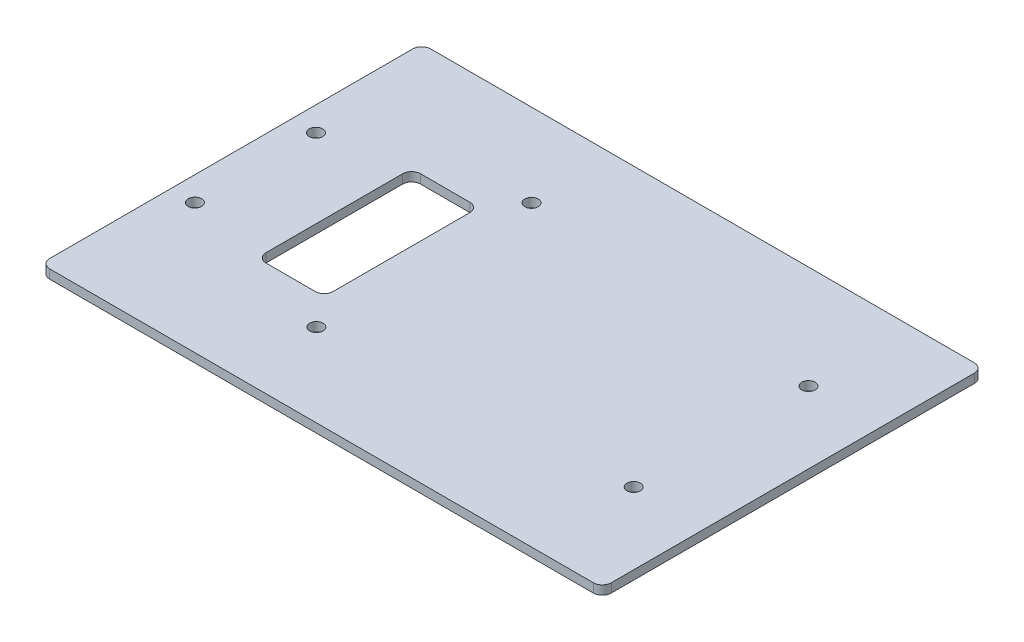
ISO-10303-21;
HEADER;
FILE_DESCRIPTION(('STEP AP214'),'2;1');
FILE_NAME('part.step','',(''),(''),'','','');
FILE_SCHEMA(('AUTOMOTIVE_DESIGN { 1 0 10303 214 1 1 1 1 }'));
ENDSEC;
DATA;
#1=APPLICATION_CONTEXT('core data for automotive mechanical design processes');
#2=APPLICATION_PROTOCOL_DEFINITION('international standard','automotive_design',2000,#1);
#3=PRODUCT_CONTEXT('',#1,'mechanical');
#4=PRODUCT('Part','Part','',(#3));
#5=PRODUCT_RELATED_PRODUCT_CATEGORY('part','',(#4));
#6=PRODUCT_DEFINITION_FORMATION('','',#4);
#7=PRODUCT_DEFINITION_CONTEXT('part definition',#1,'design');
#8=PRODUCT_DEFINITION('design','',#6,#7);
#9=PRODUCT_DEFINITION_SHAPE('','',#8);
#10=(LENGTH_UNIT() NAMED_UNIT(*) SI_UNIT(.MILLI.,.METRE.));
#11=(NAMED_UNIT(*) PLANE_ANGLE_UNIT() SI_UNIT($,.RADIAN.));
#12=(NAMED_UNIT(*) SI_UNIT($,.STERADIAN.) SOLID_ANGLE_UNIT());
#13=UNCERTAINTY_MEASURE_WITH_UNIT(LENGTH_MEASURE(1.E-05),#10,'distance_accuracy_value','');
#14=(GEOMETRIC_REPRESENTATION_CONTEXT(3) GLOBAL_UNCERTAINTY_ASSIGNED_CONTEXT((#13)) GLOBAL_UNIT_ASSIGNED_CONTEXT((#10,
#11,#12)) REPRESENTATION_CONTEXT('',''));
#15=CARTESIAN_POINT('',(0.,0.,0.));
#16=DIRECTION('',(0.,0.,1.));
#17=DIRECTION('',(1.,0.,0.));
#18=AXIS2_PLACEMENT_3D('',#15,#16,#17);
#19=CARTESIAN_POINT('',(0.,2.,0.));
#20=DIRECTION('',(0.,-1.,0.));
#21=DIRECTION('',(0.,0.,-1.));
#22=AXIS2_PLACEMENT_3D('',#19,#20,#21);
#23=PLANE('',#22);
#24=CARTESIAN_POINT('',(-57.25,2.,-13.5));
#25=DIRECTION('',(0.,-1.,0.));
#26=DIRECTION('',(0.,0.,-1.));
#27=AXIS2_PLACEMENT_3D('',#24,#25,#26);
#28=CIRCLE('',#27,1.5);
#29=CARTESIAN_POINT('',(-57.25,2.,-15.));
#30=VERTEX_POINT('',#29);
#31=EDGE_CURVE('E671',#30,#30,#28,.F.);
#32=ORIENTED_EDGE('',*,*,#31,.F.);
#33=EDGE_LOOP('',(#32));
#34=FACE_BOUND('',#33,.T.);
#35=CARTESIAN_POINT('',(-57.25,2.,13.5));
#36=DIRECTION('',(0.,-1.,0.));
#37=DIRECTION('',(0.,0.,-1.));
#38=AXIS2_PLACEMENT_3D('',#35,#36,#37);
#39=CIRCLE('',#38,1.5);
#40=CARTESIAN_POINT('',(-57.25,2.,12.));
#41=VERTEX_POINT('',#40);
#42=EDGE_CURVE('E679',#41,#41,#39,.F.);
#43=ORIENTED_EDGE('',*,*,#42,.F.);
#44=EDGE_LOOP('',(#43));
#45=FACE_BOUND('',#44,.T.);
#46=DIRECTION('',(-1.,0.,0.));
#47=VECTOR('',#46,1.);
#48=CARTESIAN_POINT('',(-62.65,2.,-42.5));
#49=LINE('',#48,#47);
#50=CARTESIAN_POINT('',(60.65,2.,-42.5));
#51=VERTEX_POINT('',#50);
#52=CARTESIAN_POINT('',(-60.65,2.,-42.5));
#53=VERTEX_POINT('',#52);
#54=EDGE_CURVE('E326',#51,#53,#49,.T.);
#55=ORIENTED_EDGE('',*,*,#54,.T.);
#56=CARTESIAN_POINT('',(-60.65,2.,-40.5));
#57=DIRECTION('',(0.,-1.,0.));
#58=DIRECTION('',(0.,0.,-1.));
#59=AXIS2_PLACEMENT_3D('',#56,#57,#58);
#60=CIRCLE('',#59,2.);
#61=CARTESIAN_POINT('',(-62.65,2.,-40.5));
#62=VERTEX_POINT('',#61);
#63=EDGE_CURVE('E253',#53,#62,#60,.F.);
#64=ORIENTED_EDGE('',*,*,#63,.T.);
#65=DIRECTION('',(0.,0.,1.));
#66=VECTOR('',#65,1.);
#67=CARTESIAN_POINT('',(-62.65,2.,42.5));
#68=LINE('',#67,#66);
#69=CARTESIAN_POINT('',(-62.65,2.,40.5));
#70=VERTEX_POINT('',#69);
#71=EDGE_CURVE('E194',#62,#70,#68,.T.);
#72=ORIENTED_EDGE('',*,*,#71,.T.);
#73=CARTESIAN_POINT('',(-60.65,2.,40.5));
#74=DIRECTION('',(0.,-1.,0.));
#75=DIRECTION('',(0.,0.,-1.));
#76=AXIS2_PLACEMENT_3D('',#73,#74,#75);
#77=CIRCLE('',#76,2.);
#78=CARTESIAN_POINT('',(-60.65,2.,42.5));
#79=VERTEX_POINT('',#78);
#80=EDGE_CURVE('E65',#70,#79,#77,.F.);
#81=ORIENTED_EDGE('',*,*,#80,.T.);
#82=DIRECTION('',(1.,0.,0.));
#83=VECTOR('',#82,1.);
#84=CARTESIAN_POINT('',(-62.65,2.,42.5));
#85=LINE('',#84,#83);
#86=CARTESIAN_POINT('',(60.65,2.,42.5));
#87=VERTEX_POINT('',#86);
#88=EDGE_CURVE('E188',#79,#87,#85,.T.);
#89=ORIENTED_EDGE('',*,*,#88,.T.);
#90=CARTESIAN_POINT('',(60.65,2.,40.5));
#91=DIRECTION('',(0.,-1.,0.));
#92=DIRECTION('',(0.,0.,-1.));
#93=AXIS2_PLACEMENT_3D('',#90,#91,#92);
#94=CIRCLE('',#93,2.);
#95=CARTESIAN_POINT('',(62.65,2.,40.5));
#96=VERTEX_POINT('',#95);
#97=EDGE_CURVE('E245',#87,#96,#94,.F.);
#98=ORIENTED_EDGE('',*,*,#97,.T.);
#99=DIRECTION('',(0.,0.,-1.));
#100=VECTOR('',#99,1.);
#101=CARTESIAN_POINT('',(62.65,2.,42.5));
#102=LINE('',#101,#100);
#103=CARTESIAN_POINT('',(62.65,2.,-40.5));
#104=VERTEX_POINT('',#103);
#105=EDGE_CURVE('E322',#96,#104,#102,.T.);
#106=ORIENTED_EDGE('',*,*,#105,.T.);
#107=CARTESIAN_POINT('',(60.65,2.,-40.5));
#108=DIRECTION('',(0.,-1.,0.));
#109=DIRECTION('',(0.,0.,-1.));
#110=AXIS2_PLACEMENT_3D('',#107,#108,#109);
#111=CIRCLE('',#110,2.);
#112=EDGE_CURVE('E248',#104,#51,#111,.F.);
#113=ORIENTED_EDGE('',*,*,#112,.T.);
#114=EDGE_LOOP('',(#55,#64,#72,#81,#89,#98,#106,#113));
#115=FACE_BOUND('',#114,.T.);
#116=DIRECTION('',(0.,0.,1.));
#117=VECTOR('',#116,1.);
#118=CARTESIAN_POINT('',(-39.65,2.,17.25));
#119=LINE('',#118,#117);
#120=CARTESIAN_POINT('',(-39.65,2.,-15.25));
#121=VERTEX_POINT('',#120);
#122=CARTESIAN_POINT('',(-39.65,2.,15.25));
#123=VERTEX_POINT('',#122);
#124=EDGE_CURVE('E292',#121,#123,#119,.T.);
#125=ORIENTED_EDGE('',*,*,#124,.F.);
#126=CARTESIAN_POINT('',(-37.65,2.,-15.25));
#127=DIRECTION('',(0.,-1.,0.));
#128=DIRECTION('',(0.,0.,-1.));
#129=AXIS2_PLACEMENT_3D('',#126,#127,#128);
#130=CIRCLE('',#129,2.);
#131=CARTESIAN_POINT('',(-37.65,2.,-17.25));
#132=VERTEX_POINT('',#131);
#133=EDGE_CURVE('E170',#121,#132,#130,.T.);
#134=ORIENTED_EDGE('',*,*,#133,.T.);
#135=DIRECTION('',(-1.,0.,0.));
#136=VECTOR('',#135,1.);
#137=CARTESIAN_POINT('',(-39.65,2.,-17.2500000000001));
#138=LINE('',#137,#136);
#139=CARTESIAN_POINT('',(-26.65,2.,-17.25));
#140=VERTEX_POINT('',#139);
#141=EDGE_CURVE('E302',#140,#132,#138,.T.);
#142=ORIENTED_EDGE('',*,*,#141,.F.);
#143=CARTESIAN_POINT('',(-26.65,2.,-15.25));
#144=DIRECTION('',(0.,-1.,0.));
#145=DIRECTION('',(0.,0.,-1.));
#146=AXIS2_PLACEMENT_3D('',#143,#144,#145);
#147=CIRCLE('',#146,2.);
#148=CARTESIAN_POINT('',(-24.65,2.,-15.25));
#149=VERTEX_POINT('',#148);
#150=EDGE_CURVE('E11',#140,#149,#147,.T.);
#151=ORIENTED_EDGE('',*,*,#150,.T.);
#152=DIRECTION('',(0.,0.,-1.));
#153=VECTOR('',#152,1.);
#154=CARTESIAN_POINT('',(-24.65,2.,17.25));
#155=LINE('',#154,#153);
#156=CARTESIAN_POINT('',(-24.65,2.,15.25));
#157=VERTEX_POINT('',#156);
#158=EDGE_CURVE('E300',#157,#149,#155,.T.);
#159=ORIENTED_EDGE('',*,*,#158,.F.);
#160=CARTESIAN_POINT('',(-26.65,2.,15.25));
#161=DIRECTION('',(0.,-1.,0.));
#162=DIRECTION('',(0.,0.,-1.));
#163=AXIS2_PLACEMENT_3D('',#160,#161,#162);
#164=CIRCLE('',#163,2.);
#165=CARTESIAN_POINT('',(-26.65,2.,17.25));
#166=VERTEX_POINT('',#165);
#167=EDGE_CURVE('E171',#157,#166,#164,.T.);
#168=ORIENTED_EDGE('',*,*,#167,.T.);
#169=DIRECTION('',(1.,0.,0.));
#170=VECTOR('',#169,1.);
#171=CARTESIAN_POINT('',(-39.65,2.,17.25));
#172=LINE('',#171,#170);
#173=CARTESIAN_POINT('',(-37.65,2.,17.25));
#174=VERTEX_POINT('',#173);
#175=EDGE_CURVE('E307',#174,#166,#172,.T.);
#176=ORIENTED_EDGE('',*,*,#175,.F.);
#177=CARTESIAN_POINT('',(-37.65,2.,15.25));
#178=DIRECTION('',(0.,-1.,0.));
#179=DIRECTION('',(0.,0.,-1.));
#180=AXIS2_PLACEMENT_3D('',#177,#178,#179);
#181=CIRCLE('',#180,2.);
#182=EDGE_CURVE('E272',#174,#123,#181,.T.);
#183=ORIENTED_EDGE('',*,*,#182,.T.);
#184=EDGE_LOOP('',(#125,#134,#142,#151,#159,#168,#176,#183));
#185=FACE_BOUND('',#184,.T.);
#186=CARTESIAN_POINT('',(-19.65,2.,-24.));
#187=DIRECTION('',(0.,1.,0.));
#188=DIRECTION('',(0.,0.,1.));
#189=AXIS2_PLACEMENT_3D('',#186,#187,#188);
#190=CIRCLE('',#189,1.5);
#191=CARTESIAN_POINT('',(-19.65,2.,-22.5));
#192=VERTEX_POINT('',#191);
#193=EDGE_CURVE('E183',#192,#192,#190,.T.);
#194=ORIENTED_EDGE('',*,*,#193,.F.);
#195=EDGE_LOOP('',(#194));
#196=FACE_BOUND('',#195,.T.);
#197=CARTESIAN_POINT('',(-19.65,2.,24.));
#198=DIRECTION('',(0.,1.,0.));
#199=DIRECTION('',(0.,0.,1.));
#200=AXIS2_PLACEMENT_3D('',#197,#198,#199);
#201=CIRCLE('',#200,1.5);
#202=CARTESIAN_POINT('',(-19.65,2.,25.5));
#203=VERTEX_POINT('',#202);
#204=EDGE_CURVE('E647',#203,#203,#201,.T.);
#205=ORIENTED_EDGE('',*,*,#204,.F.);
#206=EDGE_LOOP('',(#205));
#207=FACE_BOUND('',#206,.T.);
#208=CARTESIAN_POINT('',(46.65,2.,-19.5));
#209=DIRECTION('',(0.,1.,0.));
#210=DIRECTION('',(0.,0.,1.));
#211=AXIS2_PLACEMENT_3D('',#208,#209,#210);
#212=CIRCLE('',#211,1.5);
#213=CARTESIAN_POINT('',(46.65,2.,-18.));
#214=VERTEX_POINT('',#213);
#215=EDGE_CURVE('E655',#214,#214,#212,.T.);
#216=ORIENTED_EDGE('',*,*,#215,.F.);
#217=EDGE_LOOP('',(#216));
#218=FACE_BOUND('',#217,.T.);
#219=CARTESIAN_POINT('',(46.65,2.,19.5));
#220=DIRECTION('',(0.,1.,0.));
#221=DIRECTION('',(0.,0.,1.));
#222=AXIS2_PLACEMENT_3D('',#219,#220,#221);
#223=CIRCLE('',#222,1.5);
#224=CARTESIAN_POINT('',(46.65,2.,21.));
#225=VERTEX_POINT('',#224);
#226=EDGE_CURVE('E663',#225,#225,#223,.T.);
#227=ORIENTED_EDGE('',*,*,#226,.F.);
#228=EDGE_LOOP('',(#227));
#229=FACE_BOUND('',#228,.T.);
#230=ADVANCED_FACE('F42',(#34,#45,#115,#185,#196,#207,#218,#229),#23,.F.);
#231=CARTESIAN_POINT('',(0.,0.,0.));
#232=DIRECTION('',(0.,-1.,0.));
#233=DIRECTION('',(0.,0.,-1.));
#234=AXIS2_PLACEMENT_3D('',#231,#232,#233);
#235=PLANE('',#234);
#236=CARTESIAN_POINT('',(-57.25,0.,-13.5));
#237=DIRECTION('',(0.,-1.,0.));
#238=DIRECTION('',(0.,0.,-1.));
#239=AXIS2_PLACEMENT_3D('',#236,#237,#238);
#240=CIRCLE('',#239,1.5);
#241=CARTESIAN_POINT('',(-57.25,0.,-15.));
#242=VERTEX_POINT('',#241);
#243=EDGE_CURVE('E678',#242,#242,#240,.T.);
#244=ORIENTED_EDGE('',*,*,#243,.F.);
#245=EDGE_LOOP('',(#244));
#246=FACE_BOUND('',#245,.T.);
#247=CARTESIAN_POINT('',(-57.25,0.,13.5));
#248=DIRECTION('',(0.,-1.,0.));
#249=DIRECTION('',(0.,0.,1.));
#250=AXIS2_PLACEMENT_3D('',#247,#248,#249);
#251=CIRCLE('',#250,1.5);
#252=CARTESIAN_POINT('',(-57.25,0.,15.));
#253=VERTEX_POINT('',#252);
#254=EDGE_CURVE('E675',#253,#253,#251,.T.);
#255=ORIENTED_EDGE('',*,*,#254,.F.);
#256=EDGE_LOOP('',(#255));
#257=FACE_BOUND('',#256,.T.);
#258=CARTESIAN_POINT('',(46.65,0.,-19.5));
#259=DIRECTION('',(0.,1.,0.));
#260=DIRECTION('',(0.,0.,1.));
#261=AXIS2_PLACEMENT_3D('',#258,#259,#260);
#262=CIRCLE('',#261,1.5);
#263=CARTESIAN_POINT('',(46.65,0.,-18.));
#264=VERTEX_POINT('',#263);
#265=EDGE_CURVE('E659',#264,#264,#262,.T.);
#266=ORIENTED_EDGE('',*,*,#265,.T.);
#267=EDGE_LOOP('',(#266));
#268=FACE_BOUND('',#267,.T.);
#269=CARTESIAN_POINT('',(-19.65,0.,-24.));
#270=DIRECTION('',(0.,1.,0.));
#271=DIRECTION('',(0.,0.,1.));
#272=AXIS2_PLACEMENT_3D('',#269,#270,#271);
#273=CIRCLE('',#272,1.5);
#274=CARTESIAN_POINT('',(-19.65,0.,-22.5));
#275=VERTEX_POINT('',#274);
#276=EDGE_CURVE('E643',#275,#275,#273,.T.);
#277=ORIENTED_EDGE('',*,*,#276,.T.);
#278=EDGE_LOOP('',(#277));
#279=FACE_BOUND('',#278,.T.);
#280=DIRECTION('',(0.,0.,1.));
#281=VECTOR('',#280,1.);
#282=CARTESIAN_POINT('',(-62.65,0.,42.5));
#283=LINE('',#282,#281);
#284=CARTESIAN_POINT('',(-62.65,0.,-40.5));
#285=VERTEX_POINT('',#284);
#286=CARTESIAN_POINT('',(-62.65,0.,40.5));
#287=VERTEX_POINT('',#286);
#288=EDGE_CURVE('E338',#285,#287,#283,.T.);
#289=ORIENTED_EDGE('',*,*,#288,.F.);
#290=CARTESIAN_POINT('',(-60.65,0.,-40.5));
#291=DIRECTION('',(0.,-1.,0.));
#292=DIRECTION('',(0.,0.,-1.));
#293=AXIS2_PLACEMENT_3D('',#290,#291,#292);
#294=CIRCLE('',#293,2.);
#295=CARTESIAN_POINT('',(-60.65,0.,-42.5));
#296=VERTEX_POINT('',#295);
#297=EDGE_CURVE('E235',#285,#296,#294,.T.);
#298=ORIENTED_EDGE('',*,*,#297,.T.);
#299=DIRECTION('',(-1.,0.,0.));
#300=VECTOR('',#299,1.);
#301=CARTESIAN_POINT('',(-62.65,0.,-42.5));
#302=LINE('',#301,#300);
#303=CARTESIAN_POINT('',(60.65,0.,-42.5));
#304=VERTEX_POINT('',#303);
#305=EDGE_CURVE('E335',#304,#296,#302,.T.);
#306=ORIENTED_EDGE('',*,*,#305,.F.);
#307=CARTESIAN_POINT('',(60.65,0.,-40.5));
#308=DIRECTION('',(0.,-1.,0.));
#309=DIRECTION('',(0.,0.,-1.));
#310=AXIS2_PLACEMENT_3D('',#307,#308,#309);
#311=CIRCLE('',#310,2.);
#312=CARTESIAN_POINT('',(62.65,0.,-40.5));
#313=VERTEX_POINT('',#312);
#314=EDGE_CURVE('E229',#304,#313,#311,.T.);
#315=ORIENTED_EDGE('',*,*,#314,.T.);
#316=DIRECTION('',(0.,0.,-1.));
#317=VECTOR('',#316,1.);
#318=CARTESIAN_POINT('',(62.65,0.,42.5));
#319=LINE('',#318,#317);
#320=CARTESIAN_POINT('',(62.65,0.,40.5));
#321=VERTEX_POINT('',#320);
#322=EDGE_CURVE('E311',#321,#313,#319,.T.);
#323=ORIENTED_EDGE('',*,*,#322,.F.);
#324=CARTESIAN_POINT('',(60.65,0.,40.5));
#325=DIRECTION('',(0.,-1.,0.));
#326=DIRECTION('',(0.,0.,-1.));
#327=AXIS2_PLACEMENT_3D('',#324,#325,#326);
#328=CIRCLE('',#327,2.);
#329=CARTESIAN_POINT('',(60.65,0.,42.5));
#330=VERTEX_POINT('',#329);
#331=EDGE_CURVE('E226',#321,#330,#328,.T.);
#332=ORIENTED_EDGE('',*,*,#331,.T.);
#333=DIRECTION('',(1.,0.,0.));
#334=VECTOR('',#333,1.);
#335=CARTESIAN_POINT('',(-62.65,0.,42.5));
#336=LINE('',#335,#334);
#337=CARTESIAN_POINT('',(-60.65,0.,42.5));
#338=VERTEX_POINT('',#337);
#339=EDGE_CURVE('E197',#338,#330,#336,.T.);
#340=ORIENTED_EDGE('',*,*,#339,.F.);
#341=CARTESIAN_POINT('',(-60.65,0.,40.5));
#342=DIRECTION('',(0.,-1.,0.));
#343=DIRECTION('',(0.,0.,-1.));
#344=AXIS2_PLACEMENT_3D('',#341,#342,#343);
#345=CIRCLE('',#344,2.);
#346=EDGE_CURVE('E232',#338,#287,#345,.T.);
#347=ORIENTED_EDGE('',*,*,#346,.T.);
#348=EDGE_LOOP('',(#289,#298,#306,#315,#323,#332,#340,#347));
#349=FACE_BOUND('',#348,.T.);
#350=DIRECTION('',(0.,0.,-1.));
#351=VECTOR('',#350,1.);
#352=CARTESIAN_POINT('',(-24.65,0.,17.25));
#353=LINE('',#352,#351);
#354=CARTESIAN_POINT('',(-24.65,0.,15.25));
#355=VERTEX_POINT('',#354);
#356=CARTESIAN_POINT('',(-24.65,0.,-15.25));
#357=VERTEX_POINT('',#356);
#358=EDGE_CURVE('E283',#355,#357,#353,.T.);
#359=ORIENTED_EDGE('',*,*,#358,.T.);
#360=CARTESIAN_POINT('',(-26.65,0.,-15.25));
#361=DIRECTION('',(0.,-1.,0.));
#362=DIRECTION('',(0.,0.,-1.));
#363=AXIS2_PLACEMENT_3D('',#360,#361,#362);
#364=CIRCLE('',#363,2.);
#365=CARTESIAN_POINT('',(-26.65,0.,-17.25));
#366=VERTEX_POINT('',#365);
#367=EDGE_CURVE('E51',#357,#366,#364,.F.);
#368=ORIENTED_EDGE('',*,*,#367,.T.);
#369=DIRECTION('',(-1.,0.,0.));
#370=VECTOR('',#369,1.);
#371=CARTESIAN_POINT('',(-39.65,0.,-17.2500000000001));
#372=LINE('',#371,#370);
#373=CARTESIAN_POINT('',(-37.65,0.,-17.25));
#374=VERTEX_POINT('',#373);
#375=EDGE_CURVE('E164',#366,#374,#372,.T.);
#376=ORIENTED_EDGE('',*,*,#375,.T.);
#377=CARTESIAN_POINT('',(-37.65,0.,-15.25));
#378=DIRECTION('',(0.,-1.,0.));
#379=DIRECTION('',(0.,0.,-1.));
#380=AXIS2_PLACEMENT_3D('',#377,#378,#379);
#381=CIRCLE('',#380,2.);
#382=CARTESIAN_POINT('',(-39.65,0.,-15.25));
#383=VERTEX_POINT('',#382);
#384=EDGE_CURVE('E157',#374,#383,#381,.F.);
#385=ORIENTED_EDGE('',*,*,#384,.T.);
#386=DIRECTION('',(0.,0.,1.));
#387=VECTOR('',#386,1.);
#388=CARTESIAN_POINT('',(-39.65,0.,17.25));
#389=LINE('',#388,#387);
#390=CARTESIAN_POINT('',(-39.65,0.,15.25));
#391=VERTEX_POINT('',#390);
#392=EDGE_CURVE('E162',#383,#391,#389,.T.);
#393=ORIENTED_EDGE('',*,*,#392,.T.);
#394=CARTESIAN_POINT('',(-37.65,0.,15.25));
#395=DIRECTION('',(0.,-1.,0.));
#396=DIRECTION('',(0.,0.,-1.));
#397=AXIS2_PLACEMENT_3D('',#394,#395,#396);
#398=CIRCLE('',#397,2.);
#399=CARTESIAN_POINT('',(-37.65,0.,17.25));
#400=VERTEX_POINT('',#399);
#401=EDGE_CURVE('E269',#391,#400,#398,.F.);
#402=ORIENTED_EDGE('',*,*,#401,.T.);
#403=DIRECTION('',(1.,0.,0.));
#404=VECTOR('',#403,1.);
#405=CARTESIAN_POINT('',(-39.65,0.,17.25));
#406=LINE('',#405,#404);
#407=CARTESIAN_POINT('',(-26.65,0.,17.25));
#408=VERTEX_POINT('',#407);
#409=EDGE_CURVE('E182',#400,#408,#406,.T.);
#410=ORIENTED_EDGE('',*,*,#409,.T.);
#411=CARTESIAN_POINT('',(-26.65,0.,15.25));
#412=DIRECTION('',(0.,-1.,0.));
#413=DIRECTION('',(0.,0.,-1.));
#414=AXIS2_PLACEMENT_3D('',#411,#412,#413);
#415=CIRCLE('',#414,2.);
#416=EDGE_CURVE('E275',#408,#355,#415,.F.);
#417=ORIENTED_EDGE('',*,*,#416,.T.);
#418=EDGE_LOOP('',(#359,#368,#376,#385,#393,#402,#410,#417));
#419=FACE_BOUND('',#418,.T.);
#420=CARTESIAN_POINT('',(-19.65,0.,24.));
#421=DIRECTION('',(0.,1.,0.));
#422=DIRECTION('',(0.,0.,1.));
#423=AXIS2_PLACEMENT_3D('',#420,#421,#422);
#424=CIRCLE('',#423,1.5);
#425=CARTESIAN_POINT('',(-19.65,0.,25.5));
#426=VERTEX_POINT('',#425);
#427=EDGE_CURVE('E651',#426,#426,#424,.T.);
#428=ORIENTED_EDGE('',*,*,#427,.T.);
#429=EDGE_LOOP('',(#428));
#430=FACE_BOUND('',#429,.T.);
#431=CARTESIAN_POINT('',(46.65,0.,19.5));
#432=DIRECTION('',(0.,1.,0.));
#433=DIRECTION('',(0.,0.,1.));
#434=AXIS2_PLACEMENT_3D('',#431,#432,#433);
#435=CIRCLE('',#434,1.5);
#436=CARTESIAN_POINT('',(46.65,0.,21.));
#437=VERTEX_POINT('',#436);
#438=EDGE_CURVE('E667',#437,#437,#435,.T.);
#439=ORIENTED_EDGE('',*,*,#438,.T.);
#440=EDGE_LOOP('',(#439));
#441=FACE_BOUND('',#440,.T.);
#442=ADVANCED_FACE('F160',(#246,#257,#268,#279,#349,#419,#430,#441),#235,.T.);
#443=CARTESIAN_POINT('',(62.65,2.,42.5));
#444=DIRECTION('',(-1.,0.,0.));
#445=DIRECTION('',(0.,0.,1.));
#446=AXIS2_PLACEMENT_3D('',#443,#444,#445);
#447=PLANE('',#446);
#448=ORIENTED_EDGE('',*,*,#322,.T.);
#449=DIRECTION('',(0.,-1.,0.));
#450=VECTOR('',#449,1.);
#451=CARTESIAN_POINT('',(62.65,2.,-40.5));
#452=LINE('',#451,#450);
#453=EDGE_CURVE('E266',#313,#104,#452,.F.);
#454=ORIENTED_EDGE('',*,*,#453,.T.);
#455=ORIENTED_EDGE('',*,*,#105,.F.);
#456=DIRECTION('',(0.,-1.,0.));
#457=VECTOR('',#456,1.);
#458=CARTESIAN_POINT('',(62.65,2.,40.5));
#459=LINE('',#458,#457);
#460=EDGE_CURVE('E262',#96,#321,#459,.T.);
#461=ORIENTED_EDGE('',*,*,#460,.T.);
#462=EDGE_LOOP('',(#448,#454,#455,#461));
#463=FACE_BOUND('',#462,.T.);
#464=ADVANCED_FACE('F355',(#463),#447,.F.);
#465=CARTESIAN_POINT('',(-62.65,2.,-42.5));
#466=DIRECTION('',(0.,0.,1.));
#467=DIRECTION('',(1.,0.,0.));
#468=AXIS2_PLACEMENT_3D('',#465,#466,#467);
#469=PLANE('',#468);
#470=ORIENTED_EDGE('',*,*,#305,.T.);
#471=DIRECTION('',(0.,-1.,0.));
#472=VECTOR('',#471,1.);
#473=CARTESIAN_POINT('',(-60.65,2.,-42.5));
#474=LINE('',#473,#472);
#475=EDGE_CURVE('E242',#296,#53,#474,.F.);
#476=ORIENTED_EDGE('',*,*,#475,.T.);
#477=ORIENTED_EDGE('',*,*,#54,.F.);
#478=DIRECTION('',(0.,-1.,0.));
#479=VECTOR('',#478,1.);
#480=CARTESIAN_POINT('',(60.65,2.,-42.5));
#481=LINE('',#480,#479);
#482=EDGE_CURVE('E238',#51,#304,#481,.T.);
#483=ORIENTED_EDGE('',*,*,#482,.T.);
#484=EDGE_LOOP('',(#470,#476,#477,#483));
#485=FACE_BOUND('',#484,.T.);
#486=ADVANCED_FACE('F364',(#485),#469,.F.);
#487=CARTESIAN_POINT('',(-62.65,2.,42.5));
#488=DIRECTION('',(1.,0.,0.));
#489=DIRECTION('',(0.,0.,-1.));
#490=AXIS2_PLACEMENT_3D('',#487,#488,#489);
#491=PLANE('',#490);
#492=ORIENTED_EDGE('',*,*,#71,.F.);
#493=DIRECTION('',(0.,-1.,0.));
#494=VECTOR('',#493,1.);
#495=CARTESIAN_POINT('',(-62.65,2.,-40.5));
#496=LINE('',#495,#494);
#497=EDGE_CURVE('E222',#62,#285,#496,.T.);
#498=ORIENTED_EDGE('',*,*,#497,.T.);
#499=ORIENTED_EDGE('',*,*,#288,.T.);
#500=DIRECTION('',(0.,-1.,0.));
#501=VECTOR('',#500,1.);
#502=CARTESIAN_POINT('',(-62.65,2.,40.5));
#503=LINE('',#502,#501);
#504=EDGE_CURVE('E219',#287,#70,#503,.F.);
#505=ORIENTED_EDGE('',*,*,#504,.T.);
#506=EDGE_LOOP('',(#492,#498,#499,#505));
#507=FACE_BOUND('',#506,.T.);
#508=ADVANCED_FACE('F371',(#507),#491,.F.);
#509=CARTESIAN_POINT('',(-62.65,2.,42.5));
#510=DIRECTION('',(0.,0.,-1.));
#511=DIRECTION('',(-1.,0.,0.));
#512=AXIS2_PLACEMENT_3D('',#509,#510,#511);
#513=PLANE('',#512);
#514=ORIENTED_EDGE('',*,*,#88,.F.);
#515=DIRECTION('',(0.,-1.,0.));
#516=VECTOR('',#515,1.);
#517=CARTESIAN_POINT('',(-60.65,2.,42.5));
#518=LINE('',#517,#516);
#519=EDGE_CURVE('E258',#79,#338,#518,.T.);
#520=ORIENTED_EDGE('',*,*,#519,.T.);
#521=ORIENTED_EDGE('',*,*,#339,.T.);
#522=DIRECTION('',(0.,-1.,0.));
#523=VECTOR('',#522,1.);
#524=CARTESIAN_POINT('',(60.65,2.,42.5));
#525=LINE('',#524,#523);
#526=EDGE_CURVE('E58',#330,#87,#525,.F.);
#527=ORIENTED_EDGE('',*,*,#526,.T.);
#528=EDGE_LOOP('',(#514,#520,#521,#527));
#529=FACE_BOUND('',#528,.T.);
#530=ADVANCED_FACE('F346',(#529),#513,.F.);
#531=CARTESIAN_POINT('',(-39.65,2.,17.25));
#532=DIRECTION('',(1.,0.,0.));
#533=DIRECTION('',(0.,0.,-1.));
#534=AXIS2_PLACEMENT_3D('',#531,#532,#533);
#535=PLANE('',#534);
#536=ORIENTED_EDGE('',*,*,#124,.T.);
#537=DIRECTION('',(0.,-1.,0.));
#538=VECTOR('',#537,1.);
#539=CARTESIAN_POINT('',(-39.65,0.,15.25));
#540=LINE('',#539,#538);
#541=EDGE_CURVE('E180',#123,#391,#540,.T.);
#542=ORIENTED_EDGE('',*,*,#541,.T.);
#543=ORIENTED_EDGE('',*,*,#392,.F.);
#544=DIRECTION('',(0.,-1.,0.));
#545=VECTOR('',#544,1.);
#546=CARTESIAN_POINT('',(-39.65,2.,-15.25));
#547=LINE('',#546,#545);
#548=EDGE_CURVE('E177',#383,#121,#547,.F.);
#549=ORIENTED_EDGE('',*,*,#548,.T.);
#550=EDGE_LOOP('',(#536,#542,#543,#549));
#551=FACE_BOUND('',#550,.T.);
#552=ADVANCED_FACE('F176',(#551),#535,.T.);
#553=CARTESIAN_POINT('',(-39.65,2.,17.25));
#554=DIRECTION('',(0.,0.,-1.));
#555=DIRECTION('',(-1.,0.,0.));
#556=AXIS2_PLACEMENT_3D('',#553,#554,#555);
#557=PLANE('',#556);
#558=ORIENTED_EDGE('',*,*,#409,.F.);
#559=DIRECTION('',(0.,-1.,0.));
#560=VECTOR('',#559,1.);
#561=CARTESIAN_POINT('',(-37.65,2.,17.25));
#562=LINE('',#561,#560);
#563=EDGE_CURVE('E203',#400,#174,#562,.F.);
#564=ORIENTED_EDGE('',*,*,#563,.T.);
#565=ORIENTED_EDGE('',*,*,#175,.T.);
#566=DIRECTION('',(0.,-1.,0.));
#567=VECTOR('',#566,1.);
#568=CARTESIAN_POINT('',(-26.65,0.,17.25));
#569=LINE('',#568,#567);
#570=EDGE_CURVE('E192',#166,#408,#569,.T.);
#571=ORIENTED_EDGE('',*,*,#570,.T.);
#572=EDGE_LOOP('',(#558,#564,#565,#571));
#573=FACE_BOUND('',#572,.T.);
#574=ADVANCED_FACE('F448',(#573),#557,.T.);
#575=CARTESIAN_POINT('',(-24.65,2.,17.25));
#576=DIRECTION('',(-1.,0.,0.));
#577=DIRECTION('',(0.,0.,1.));
#578=AXIS2_PLACEMENT_3D('',#575,#576,#577);
#579=PLANE('',#578);
#580=ORIENTED_EDGE('',*,*,#358,.F.);
#581=DIRECTION('',(0.,-1.,0.));
#582=VECTOR('',#581,1.);
#583=CARTESIAN_POINT('',(-24.65,2.,15.25));
#584=LINE('',#583,#582);
#585=EDGE_CURVE('E210',#355,#157,#584,.F.);
#586=ORIENTED_EDGE('',*,*,#585,.T.);
#587=ORIENTED_EDGE('',*,*,#158,.T.);
#588=DIRECTION('',(0.,-1.,0.));
#589=VECTOR('',#588,1.);
#590=CARTESIAN_POINT('',(-24.65,0.,-15.25));
#591=LINE('',#590,#589);
#592=EDGE_CURVE('E206',#149,#357,#591,.T.);
#593=ORIENTED_EDGE('',*,*,#592,.T.);
#594=EDGE_LOOP('',(#580,#586,#587,#593));
#595=FACE_BOUND('',#594,.T.);
#596=ADVANCED_FACE('F304',(#595),#579,.T.);
#597=CARTESIAN_POINT('',(-39.65,2.,-17.2500000000001));
#598=DIRECTION('',(0.,0.,1.));
#599=DIRECTION('',(1.,0.,0.));
#600=AXIS2_PLACEMENT_3D('',#597,#598,#599);
#601=PLANE('',#600);
#602=ORIENTED_EDGE('',*,*,#141,.T.);
#603=DIRECTION('',(0.,-1.,0.));
#604=VECTOR('',#603,1.);
#605=CARTESIAN_POINT('',(-37.65,0.,-17.25));
#606=LINE('',#605,#604);
#607=EDGE_CURVE('E216',#132,#374,#606,.T.);
#608=ORIENTED_EDGE('',*,*,#607,.T.);
#609=ORIENTED_EDGE('',*,*,#375,.F.);
#610=DIRECTION('',(0.,-1.,0.));
#611=VECTOR('',#610,1.);
#612=CARTESIAN_POINT('',(-26.65,2.,-17.25));
#613=LINE('',#612,#611);
#614=EDGE_CURVE('E213',#366,#140,#613,.F.);
#615=ORIENTED_EDGE('',*,*,#614,.T.);
#616=EDGE_LOOP('',(#602,#608,#609,#615));
#617=FACE_BOUND('',#616,.T.);
#618=ADVANCED_FACE('F289',(#617),#601,.T.);
#619=CARTESIAN_POINT('',(-19.65,2.,-24.));
#620=DIRECTION('',(0.,-1.,0.));
#621=DIRECTION('',(0.,0.,-1.));
#622=AXIS2_PLACEMENT_3D('',#619,#620,#621);
#623=CYLINDRICAL_SURFACE('',#622,1.5);
#624=ORIENTED_EDGE('',*,*,#193,.T.);
#625=EDGE_LOOP('',(#624));
#626=FACE_BOUND('',#625,.T.);
#627=ORIENTED_EDGE('',*,*,#276,.F.);
#628=EDGE_LOOP('',(#627));
#629=FACE_BOUND('',#628,.T.);
#630=ADVANCED_FACE('F439',(#626,#629),#623,.F.);
#631=CARTESIAN_POINT('',(-19.65,2.,24.));
#632=DIRECTION('',(0.,-1.,0.));
#633=DIRECTION('',(0.,0.,-1.));
#634=AXIS2_PLACEMENT_3D('',#631,#632,#633);
#635=CYLINDRICAL_SURFACE('',#634,1.5);
#636=ORIENTED_EDGE('',*,*,#204,.T.);
#637=EDGE_LOOP('',(#636));
#638=FACE_BOUND('',#637,.T.);
#639=ORIENTED_EDGE('',*,*,#427,.F.);
#640=EDGE_LOOP('',(#639));
#641=FACE_BOUND('',#640,.T.);
#642=ADVANCED_FACE('F435',(#638,#641),#635,.F.);
#643=CARTESIAN_POINT('',(46.65,2.,-19.5));
#644=DIRECTION('',(0.,-1.,0.));
#645=DIRECTION('',(0.,0.,-1.));
#646=AXIS2_PLACEMENT_3D('',#643,#644,#645);
#647=CYLINDRICAL_SURFACE('',#646,1.5);
#648=ORIENTED_EDGE('',*,*,#215,.T.);
#649=EDGE_LOOP('',(#648));
#650=FACE_BOUND('',#649,.T.);
#651=ORIENTED_EDGE('',*,*,#265,.F.);
#652=EDGE_LOOP('',(#651));
#653=FACE_BOUND('',#652,.T.);
#654=ADVANCED_FACE('F431',(#650,#653),#647,.F.);
#655=CARTESIAN_POINT('',(46.65,2.,19.5));
#656=DIRECTION('',(0.,-1.,0.));
#657=DIRECTION('',(0.,0.,-1.));
#658=AXIS2_PLACEMENT_3D('',#655,#656,#657);
#659=CYLINDRICAL_SURFACE('',#658,1.5);
#660=ORIENTED_EDGE('',*,*,#226,.T.);
#661=EDGE_LOOP('',(#660));
#662=FACE_BOUND('',#661,.T.);
#663=ORIENTED_EDGE('',*,*,#438,.F.);
#664=EDGE_LOOP('',(#663));
#665=FACE_BOUND('',#664,.T.);
#666=ADVANCED_FACE('F399',(#662,#665),#659,.F.);
#667=CARTESIAN_POINT('',(-37.65,2.,15.25));
#668=DIRECTION('',(0.,1.,0.));
#669=DIRECTION('',(0.,0.,1.));
#670=AXIS2_PLACEMENT_3D('',#667,#668,#669);
#671=CYLINDRICAL_SURFACE('',#670,2.);
#672=ORIENTED_EDGE('',*,*,#182,.F.);
#673=ORIENTED_EDGE('',*,*,#563,.F.);
#674=ORIENTED_EDGE('',*,*,#401,.F.);
#675=ORIENTED_EDGE('',*,*,#541,.F.);
#676=EDGE_LOOP('',(#672,#673,#674,#675));
#677=FACE_BOUND('',#676,.T.);
#678=ADVANCED_FACE('F395',(#677),#671,.F.);
#679=CARTESIAN_POINT('',(-26.65,2.,15.25));
#680=DIRECTION('',(0.,1.,0.));
#681=DIRECTION('',(0.,0.,1.));
#682=AXIS2_PLACEMENT_3D('',#679,#680,#681);
#683=CYLINDRICAL_SURFACE('',#682,2.);
#684=ORIENTED_EDGE('',*,*,#167,.F.);
#685=ORIENTED_EDGE('',*,*,#585,.F.);
#686=ORIENTED_EDGE('',*,*,#416,.F.);
#687=ORIENTED_EDGE('',*,*,#570,.F.);
#688=EDGE_LOOP('',(#684,#685,#686,#687));
#689=FACE_BOUND('',#688,.T.);
#690=ADVANCED_FACE('F398',(#689),#683,.F.);
#691=CARTESIAN_POINT('',(-37.65,2.,-15.25));
#692=DIRECTION('',(0.,1.,0.));
#693=DIRECTION('',(0.,0.,1.));
#694=AXIS2_PLACEMENT_3D('',#691,#692,#693);
#695=CYLINDRICAL_SURFACE('',#694,2.);
#696=ORIENTED_EDGE('',*,*,#133,.F.);
#697=ORIENTED_EDGE('',*,*,#548,.F.);
#698=ORIENTED_EDGE('',*,*,#384,.F.);
#699=ORIENTED_EDGE('',*,*,#607,.F.);
#700=EDGE_LOOP('',(#696,#697,#698,#699));
#701=FACE_BOUND('',#700,.T.);
#702=ADVANCED_FACE('F186',(#701),#695,.F.);
#703=CARTESIAN_POINT('',(-26.65,2.,-15.25));
#704=DIRECTION('',(0.,1.,0.));
#705=DIRECTION('',(0.,0.,1.));
#706=AXIS2_PLACEMENT_3D('',#703,#704,#705);
#707=CYLINDRICAL_SURFACE('',#706,2.);
#708=ORIENTED_EDGE('',*,*,#150,.F.);
#709=ORIENTED_EDGE('',*,*,#614,.F.);
#710=ORIENTED_EDGE('',*,*,#367,.F.);
#711=ORIENTED_EDGE('',*,*,#592,.F.);
#712=EDGE_LOOP('',(#708,#709,#710,#711));
#713=FACE_BOUND('',#712,.T.);
#714=ADVANCED_FACE('F295',(#713),#707,.F.);
#715=CARTESIAN_POINT('',(-60.65,2.,-40.5));
#716=DIRECTION('',(0.,-1.,0.));
#717=DIRECTION('',(0.,0.,-1.));
#718=AXIS2_PLACEMENT_3D('',#715,#716,#717);
#719=CYLINDRICAL_SURFACE('',#718,2.);
#720=ORIENTED_EDGE('',*,*,#63,.F.);
#721=ORIENTED_EDGE('',*,*,#475,.F.);
#722=ORIENTED_EDGE('',*,*,#297,.F.);
#723=ORIENTED_EDGE('',*,*,#497,.F.);
#724=EDGE_LOOP('',(#720,#721,#722,#723));
#725=FACE_BOUND('',#724,.T.);
#726=ADVANCED_FACE('F368',(#725),#719,.T.);
#727=CARTESIAN_POINT('',(-60.65,2.,40.5));
#728=DIRECTION('',(0.,-1.,0.));
#729=DIRECTION('',(0.,0.,-1.));
#730=AXIS2_PLACEMENT_3D('',#727,#728,#729);
#731=CYLINDRICAL_SURFACE('',#730,2.);
#732=ORIENTED_EDGE('',*,*,#80,.F.);
#733=ORIENTED_EDGE('',*,*,#504,.F.);
#734=ORIENTED_EDGE('',*,*,#346,.F.);
#735=ORIENTED_EDGE('',*,*,#519,.F.);
#736=EDGE_LOOP('',(#732,#733,#734,#735));
#737=FACE_BOUND('',#736,.T.);
#738=ADVANCED_FACE('F373',(#737),#731,.T.);
#739=CARTESIAN_POINT('',(60.65,2.,-40.5));
#740=DIRECTION('',(0.,-1.,0.));
#741=DIRECTION('',(0.,0.,-1.));
#742=AXIS2_PLACEMENT_3D('',#739,#740,#741);
#743=CYLINDRICAL_SURFACE('',#742,2.);
#744=ORIENTED_EDGE('',*,*,#112,.F.);
#745=ORIENTED_EDGE('',*,*,#453,.F.);
#746=ORIENTED_EDGE('',*,*,#314,.F.);
#747=ORIENTED_EDGE('',*,*,#482,.F.);
#748=EDGE_LOOP('',(#744,#745,#746,#747));
#749=FACE_BOUND('',#748,.T.);
#750=ADVANCED_FACE('F359',(#749),#743,.T.);
#751=CARTESIAN_POINT('',(60.65,2.,40.5));
#752=DIRECTION('',(0.,-1.,0.));
#753=DIRECTION('',(0.,0.,-1.));
#754=AXIS2_PLACEMENT_3D('',#751,#752,#753);
#755=CYLINDRICAL_SURFACE('',#754,2.);
#756=ORIENTED_EDGE('',*,*,#97,.F.);
#757=ORIENTED_EDGE('',*,*,#526,.F.);
#758=ORIENTED_EDGE('',*,*,#331,.F.);
#759=ORIENTED_EDGE('',*,*,#460,.F.);
#760=EDGE_LOOP('',(#756,#757,#758,#759));
#761=FACE_BOUND('',#760,.T.);
#762=ADVANCED_FACE('F44',(#761),#755,.T.);
#763=CARTESIAN_POINT('',(-57.25,2.001,13.5));
#764=DIRECTION('',(0.,-1.,0.));
#765=DIRECTION('',(0.,0.,-1.));
#766=AXIS2_PLACEMENT_3D('',#763,#764,#765);
#767=CYLINDRICAL_SURFACE('',#766,1.5);
#768=ORIENTED_EDGE('',*,*,#254,.T.);
#769=EDGE_LOOP('',(#768));
#770=FACE_BOUND('',#769,.T.);
#771=ORIENTED_EDGE('',*,*,#42,.T.);
#772=EDGE_LOOP('',(#771));
#773=FACE_BOUND('',#772,.T.);
#774=ADVANCED_FACE('F415',(#770,#773),#767,.F.);
#775=CARTESIAN_POINT('',(-57.25,2.001,-13.5));
#776=DIRECTION('',(0.,-1.,0.));
#777=DIRECTION('',(0.,0.,-1.));
#778=AXIS2_PLACEMENT_3D('',#775,#776,#777);
#779=CYLINDRICAL_SURFACE('',#778,1.5);
#780=ORIENTED_EDGE('',*,*,#243,.T.);
#781=EDGE_LOOP('',(#780));
#782=FACE_BOUND('',#781,.T.);
#783=ORIENTED_EDGE('',*,*,#31,.T.);
#784=EDGE_LOOP('',(#783));
#785=FACE_BOUND('',#784,.T.);
#786=ADVANCED_FACE('F419',(#782,#785),#779,.F.);
#787=CLOSED_SHELL('',(#230,#442,#464,#486,#508,#530,#552,#574,#596,#618,#630,#642,#654,#666,
#678,#690,#702,#714,#726,#738,#750,#762,#774,#786));
#788=MANIFOLD_SOLID_BREP('B2',#787);
#789=ADVANCED_BREP_SHAPE_REPRESENTATION('',(#18,#788),#14);
#790=SHAPE_DEFINITION_REPRESENTATION(#9,#789);
ENDSEC;
END-ISO-10303-21;
